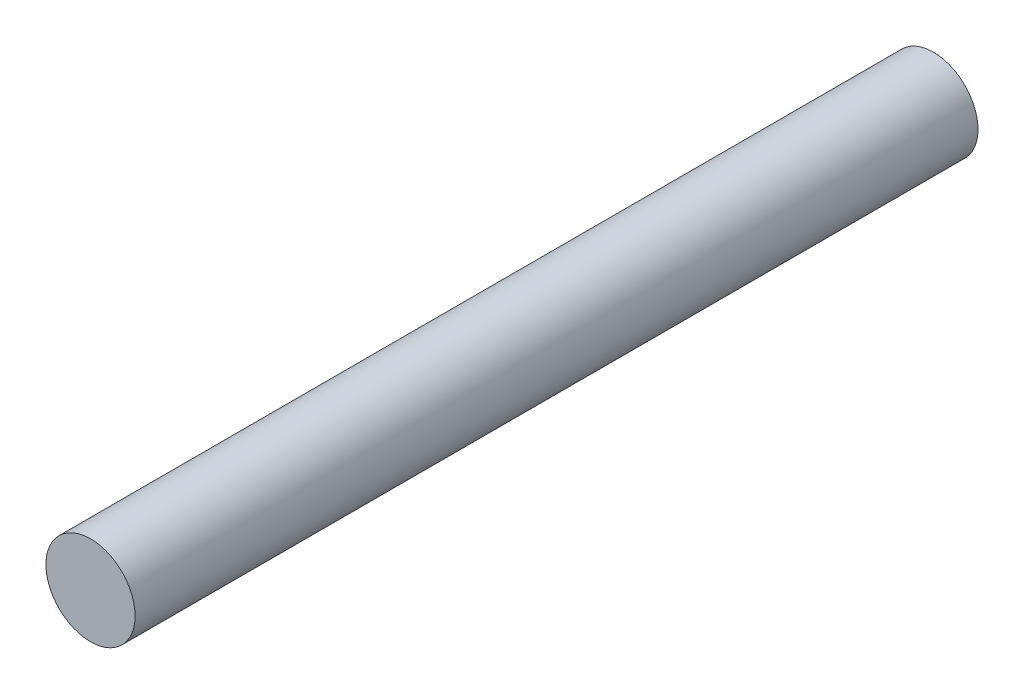
ISO-10303-21;
HEADER;
FILE_DESCRIPTION(('STEP AP214'),'2;1');
FILE_NAME('part.step','',(''),(''),'','','');
FILE_SCHEMA(('AUTOMOTIVE_DESIGN { 1 0 10303 214 1 1 1 1 }'));
ENDSEC;
DATA;
#1=APPLICATION_CONTEXT('core data for automotive mechanical design processes');
#2=APPLICATION_PROTOCOL_DEFINITION('international standard','automotive_design',2000,#1);
#3=PRODUCT_CONTEXT('',#1,'mechanical');
#4=PRODUCT('Part','Part','',(#3));
#5=PRODUCT_RELATED_PRODUCT_CATEGORY('part','',(#4));
#6=PRODUCT_DEFINITION_FORMATION('','',#4);
#7=PRODUCT_DEFINITION_CONTEXT('part definition',#1,'design');
#8=PRODUCT_DEFINITION('design','',#6,#7);
#9=PRODUCT_DEFINITION_SHAPE('','',#8);
#10=(LENGTH_UNIT() NAMED_UNIT(*) SI_UNIT(.MILLI.,.METRE.));
#11=(NAMED_UNIT(*) PLANE_ANGLE_UNIT() SI_UNIT($,.RADIAN.));
#12=(NAMED_UNIT(*) SI_UNIT($,.STERADIAN.) SOLID_ANGLE_UNIT());
#13=UNCERTAINTY_MEASURE_WITH_UNIT(LENGTH_MEASURE(1.E-05),#10,'distance_accuracy_value','');
#14=(GEOMETRIC_REPRESENTATION_CONTEXT(3) GLOBAL_UNCERTAINTY_ASSIGNED_CONTEXT((#13)) GLOBAL_UNIT_ASSIGNED_CONTEXT((#10,
#11,#12)) REPRESENTATION_CONTEXT('',''));
#15=CARTESIAN_POINT('',(0.,0.,0.));
#16=DIRECTION('',(0.,0.,1.));
#17=DIRECTION('',(1.,0.,0.));
#18=AXIS2_PLACEMENT_3D('',#15,#16,#17);
#19=CARTESIAN_POINT('',(0.,0.,120.));
#20=DIRECTION('',(0.,0.,-1.));
#21=DIRECTION('',(-1.,0.,0.));
#22=AXIS2_PLACEMENT_3D('',#19,#20,#21);
#23=CYLINDRICAL_SURFACE('',#22,12.7);
#24=CARTESIAN_POINT('',(0.,0.,120.));
#25=DIRECTION('',(0.,0.,1.));
#26=DIRECTION('',(1.,0.,0.));
#27=AXIS2_PLACEMENT_3D('',#24,#25,#26);
#28=CIRCLE('',#27,12.7);
#29=CARTESIAN_POINT('',(12.7,0.,120.));
#30=VERTEX_POINT('',#29);
#31=EDGE_CURVE('E10',#30,#30,#28,.T.);
#32=ORIENTED_EDGE('',*,*,#31,.F.);
#33=EDGE_LOOP('',(#32));
#34=FACE_BOUND('',#33,.T.);
#35=CARTESIAN_POINT('',(0.,0.,-120.));
#36=DIRECTION('',(0.,0.,1.));
#37=DIRECTION('',(1.,0.,0.));
#38=AXIS2_PLACEMENT_3D('',#35,#36,#37);
#39=CIRCLE('',#38,12.7);
#40=CARTESIAN_POINT('',(12.7,0.,-120.));
#41=VERTEX_POINT('',#40);
#42=EDGE_CURVE('E37',#41,#41,#39,.T.);
#43=ORIENTED_EDGE('',*,*,#42,.T.);
#44=EDGE_LOOP('',(#43));
#45=FACE_BOUND('',#44,.T.);
#46=ADVANCED_FACE('F40',(#34,#45),#23,.T.);
#47=CARTESIAN_POINT('',(0.,0.,120.));
#48=DIRECTION('',(0.,0.,1.));
#49=DIRECTION('',(1.,0.,0.));
#50=AXIS2_PLACEMENT_3D('',#47,#48,#49);
#51=PLANE('',#50);
#52=ORIENTED_EDGE('',*,*,#31,.T.);
#53=EDGE_LOOP('',(#52));
#54=FACE_BOUND('',#53,.T.);
#55=ADVANCED_FACE('F55',(#54),#51,.T.);
#56=CARTESIAN_POINT('',(0.,0.,-120.));
#57=DIRECTION('',(0.,0.,1.));
#58=DIRECTION('',(1.,0.,0.));
#59=AXIS2_PLACEMENT_3D('',#56,#57,#58);
#60=PLANE('',#59);
#61=ORIENTED_EDGE('',*,*,#42,.F.);
#62=EDGE_LOOP('',(#61));
#63=FACE_BOUND('',#62,.T.);
#64=ADVANCED_FACE('F49',(#63),#60,.F.);
#65=CLOSED_SHELL('',(#46,#55,#64));
#66=MANIFOLD_SOLID_BREP('B2',#65);
#67=ADVANCED_BREP_SHAPE_REPRESENTATION('',(#18,#66),#14);
#68=SHAPE_DEFINITION_REPRESENTATION(#9,#67);
ENDSEC;
END-ISO-10303-21;
